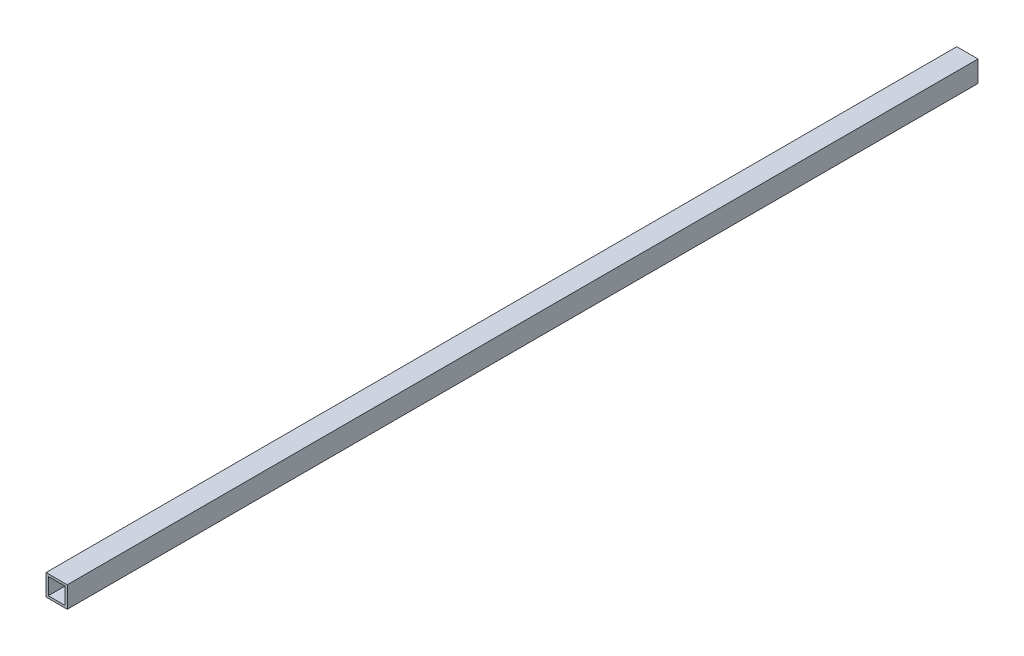
ISO-10303-21;
HEADER;
FILE_DESCRIPTION(('STEP AP214'),'2;1');
FILE_NAME('part.step','',(''),(''),'','','');
FILE_SCHEMA(('AUTOMOTIVE_DESIGN { 1 0 10303 214 1 1 1 1 }'));
ENDSEC;
DATA;
#1=APPLICATION_CONTEXT('core data for automotive mechanical design processes');
#2=APPLICATION_PROTOCOL_DEFINITION('international standard','automotive_design',2000,#1);
#3=PRODUCT_CONTEXT('',#1,'mechanical');
#4=PRODUCT('Part','Part','',(#3));
#5=PRODUCT_RELATED_PRODUCT_CATEGORY('part','',(#4));
#6=PRODUCT_DEFINITION_FORMATION('','',#4);
#7=PRODUCT_DEFINITION_CONTEXT('part definition',#1,'design');
#8=PRODUCT_DEFINITION('design','',#6,#7);
#9=PRODUCT_DEFINITION_SHAPE('','',#8);
#10=(LENGTH_UNIT() NAMED_UNIT(*) SI_UNIT(.MILLI.,.METRE.));
#11=(NAMED_UNIT(*) PLANE_ANGLE_UNIT() SI_UNIT($,.RADIAN.));
#12=(NAMED_UNIT(*) SI_UNIT($,.STERADIAN.) SOLID_ANGLE_UNIT());
#13=UNCERTAINTY_MEASURE_WITH_UNIT(LENGTH_MEASURE(1.E-05),#10,'distance_accuracy_value','');
#14=(GEOMETRIC_REPRESENTATION_CONTEXT(3) GLOBAL_UNCERTAINTY_ASSIGNED_CONTEXT((#13)) GLOBAL_UNIT_ASSIGNED_CONTEXT((#10,
#11,#12)) REPRESENTATION_CONTEXT('',''));
#15=CARTESIAN_POINT('',(0.,0.,0.));
#16=DIRECTION('',(0.,0.,1.));
#17=DIRECTION('',(1.,0.,0.));
#18=AXIS2_PLACEMENT_3D('',#15,#16,#17);
#19=CARTESIAN_POINT('',(0.,0.,600.));
#20=DIRECTION('',(0.,0.,1.));
#21=DIRECTION('',(1.,0.,0.));
#22=AXIS2_PLACEMENT_3D('',#19,#20,#21);
#23=PLANE('',#22);
#24=DIRECTION('',(0.,1.,0.));
#25=VECTOR('',#24,1.);
#26=CARTESIAN_POINT('',(7.,5.5,600.));
#27=LINE('',#26,#25);
#28=CARTESIAN_POINT('',(7.,-7.,600.));
#29=VERTEX_POINT('',#28);
#30=CARTESIAN_POINT('',(7.,7.,600.));
#31=VERTEX_POINT('',#30);
#32=EDGE_CURVE('E158',#29,#31,#27,.T.);
#33=ORIENTED_EDGE('',*,*,#32,.T.);
#34=DIRECTION('',(-1.,0.,0.));
#35=VECTOR('',#34,1.);
#36=CARTESIAN_POINT('',(-5.5,7.,600.));
#37=LINE('',#36,#35);
#38=CARTESIAN_POINT('',(-7.,7.,600.));
#39=VERTEX_POINT('',#38);
#40=EDGE_CURVE('E161',#31,#39,#37,.T.);
#41=ORIENTED_EDGE('',*,*,#40,.T.);
#42=DIRECTION('',(0.,-1.,0.));
#43=VECTOR('',#42,1.);
#44=CARTESIAN_POINT('',(-7.,5.5,600.));
#45=LINE('',#44,#43);
#46=CARTESIAN_POINT('',(-7.,-7.,600.));
#47=VERTEX_POINT('',#46);
#48=EDGE_CURVE('E164',#39,#47,#45,.T.);
#49=ORIENTED_EDGE('',*,*,#48,.T.);
#50=DIRECTION('',(1.,0.,0.));
#51=VECTOR('',#50,1.);
#52=CARTESIAN_POINT('',(-5.5,-7.,600.));
#53=LINE('',#52,#51);
#54=EDGE_CURVE('E166',#47,#29,#53,.T.);
#55=ORIENTED_EDGE('',*,*,#54,.T.);
#56=EDGE_LOOP('',(#33,#41,#49,#55));
#57=FACE_BOUND('',#56,.T.);
#58=DIRECTION('',(-1.,0.,0.));
#59=VECTOR('',#58,1.);
#60=CARTESIAN_POINT('',(-5.5,5.5,600.));
#61=LINE('',#60,#59);
#62=CARTESIAN_POINT('',(5.5,5.5,600.));
#63=VERTEX_POINT('',#62);
#64=CARTESIAN_POINT('',(-5.5,5.5,600.));
#65=VERTEX_POINT('',#64);
#66=EDGE_CURVE('E130',#63,#65,#61,.T.);
#67=ORIENTED_EDGE('',*,*,#66,.F.);
#68=DIRECTION('',(0.,1.,0.));
#69=VECTOR('',#68,1.);
#70=CARTESIAN_POINT('',(5.5,5.5,600.));
#71=LINE('',#70,#69);
#72=CARTESIAN_POINT('',(5.5,-5.5,600.));
#73=VERTEX_POINT('',#72);
#74=EDGE_CURVE('E122',#73,#63,#71,.T.);
#75=ORIENTED_EDGE('',*,*,#74,.F.);
#76=DIRECTION('',(1.,0.,0.));
#77=VECTOR('',#76,1.);
#78=CARTESIAN_POINT('',(-5.5,-5.5,600.));
#79=LINE('',#78,#77);
#80=CARTESIAN_POINT('',(-5.5,-5.5,600.));
#81=VERTEX_POINT('',#80);
#82=EDGE_CURVE('E144',#81,#73,#79,.T.);
#83=ORIENTED_EDGE('',*,*,#82,.F.);
#84=DIRECTION('',(0.,-1.,0.));
#85=VECTOR('',#84,1.);
#86=CARTESIAN_POINT('',(-5.5,5.5,600.));
#87=LINE('',#86,#85);
#88=EDGE_CURVE('E142',#65,#81,#87,.T.);
#89=ORIENTED_EDGE('',*,*,#88,.F.);
#90=EDGE_LOOP('',(#67,#75,#83,#89));
#91=FACE_BOUND('',#90,.T.);
#92=ADVANCED_FACE('F57',(#57,#91),#23,.T.);
#93=CARTESIAN_POINT('',(0.,0.,0.));
#94=DIRECTION('',(0.,0.,1.));
#95=DIRECTION('',(1.,0.,0.));
#96=AXIS2_PLACEMENT_3D('',#93,#94,#95);
#97=PLANE('',#96);
#98=DIRECTION('',(0.,1.,0.));
#99=VECTOR('',#98,1.);
#100=CARTESIAN_POINT('',(7.,5.5,0.));
#101=LINE('',#100,#99);
#102=CARTESIAN_POINT('',(7.,-7.,0.));
#103=VERTEX_POINT('',#102);
#104=CARTESIAN_POINT('',(7.,7.,0.));
#105=VERTEX_POINT('',#104);
#106=EDGE_CURVE('E138',#103,#105,#101,.T.);
#107=ORIENTED_EDGE('',*,*,#106,.F.);
#108=DIRECTION('',(1.,0.,0.));
#109=VECTOR('',#108,1.);
#110=CARTESIAN_POINT('',(-5.5,-7.,0.));
#111=LINE('',#110,#109);
#112=CARTESIAN_POINT('',(-7.,-7.,0.));
#113=VERTEX_POINT('',#112);
#114=EDGE_CURVE('E162',#113,#103,#111,.T.);
#115=ORIENTED_EDGE('',*,*,#114,.F.);
#116=DIRECTION('',(0.,-1.,0.));
#117=VECTOR('',#116,1.);
#118=CARTESIAN_POINT('',(-7.,5.5,0.));
#119=LINE('',#118,#117);
#120=CARTESIAN_POINT('',(-7.,7.,0.));
#121=VERTEX_POINT('',#120);
#122=EDGE_CURVE('E173',#121,#113,#119,.T.);
#123=ORIENTED_EDGE('',*,*,#122,.F.);
#124=DIRECTION('',(-1.,0.,0.));
#125=VECTOR('',#124,1.);
#126=CARTESIAN_POINT('',(-5.5,7.,0.));
#127=LINE('',#126,#125);
#128=EDGE_CURVE('E171',#105,#121,#127,.T.);
#129=ORIENTED_EDGE('',*,*,#128,.F.);
#130=EDGE_LOOP('',(#107,#115,#123,#129));
#131=FACE_BOUND('',#130,.T.);
#132=DIRECTION('',(0.,1.,0.));
#133=VECTOR('',#132,1.);
#134=CARTESIAN_POINT('',(5.5,5.5,0.));
#135=LINE('',#134,#133);
#136=CARTESIAN_POINT('',(5.5,-5.5,0.));
#137=VERTEX_POINT('',#136);
#138=CARTESIAN_POINT('',(5.5,5.5,0.));
#139=VERTEX_POINT('',#138);
#140=EDGE_CURVE('E80',#137,#139,#135,.T.);
#141=ORIENTED_EDGE('',*,*,#140,.T.);
#142=DIRECTION('',(-1.,0.,0.));
#143=VECTOR('',#142,1.);
#144=CARTESIAN_POINT('',(-5.5,5.5,0.));
#145=LINE('',#144,#143);
#146=CARTESIAN_POINT('',(-5.5,5.5,0.));
#147=VERTEX_POINT('',#146);
#148=EDGE_CURVE('E137',#139,#147,#145,.T.);
#149=ORIENTED_EDGE('',*,*,#148,.T.);
#150=DIRECTION('',(0.,-1.,0.));
#151=VECTOR('',#150,1.);
#152=CARTESIAN_POINT('',(-5.5,5.5,0.));
#153=LINE('',#152,#151);
#154=CARTESIAN_POINT('',(-5.5,-5.5,0.));
#155=VERTEX_POINT('',#154);
#156=EDGE_CURVE('E150',#147,#155,#153,.T.);
#157=ORIENTED_EDGE('',*,*,#156,.T.);
#158=DIRECTION('',(1.,0.,0.));
#159=VECTOR('',#158,1.);
#160=CARTESIAN_POINT('',(-5.5,-5.5,0.));
#161=LINE('',#160,#159);
#162=EDGE_CURVE('E131',#155,#137,#161,.T.);
#163=ORIENTED_EDGE('',*,*,#162,.T.);
#164=EDGE_LOOP('',(#141,#149,#157,#163));
#165=FACE_BOUND('',#164,.T.);
#166=ADVANCED_FACE('F191',(#131,#165),#97,.F.);
#167=CARTESIAN_POINT('',(7.,5.5,600.));
#168=DIRECTION('',(-1.,0.,0.));
#169=DIRECTION('',(0.,-1.,0.));
#170=AXIS2_PLACEMENT_3D('',#167,#168,#169);
#171=PLANE('',#170);
#172=ORIENTED_EDGE('',*,*,#106,.T.);
#173=DIRECTION('',(0.,0.,-1.));
#174=VECTOR('',#173,1.);
#175=CARTESIAN_POINT('',(7.,7.,600.));
#176=LINE('',#175,#174);
#177=EDGE_CURVE('E12',#31,#105,#176,.T.);
#178=ORIENTED_EDGE('',*,*,#177,.F.);
#179=ORIENTED_EDGE('',*,*,#32,.F.);
#180=DIRECTION('',(0.,0.,-1.));
#181=VECTOR('',#180,1.);
#182=CARTESIAN_POINT('',(7.,-7.,600.));
#183=LINE('',#182,#181);
#184=EDGE_CURVE('E168',#29,#103,#183,.T.);
#185=ORIENTED_EDGE('',*,*,#184,.T.);
#186=EDGE_LOOP('',(#172,#178,#179,#185));
#187=FACE_BOUND('',#186,.T.);
#188=ADVANCED_FACE('F59',(#187),#171,.F.);
#189=CARTESIAN_POINT('',(-5.5,7.,600.));
#190=DIRECTION('',(0.,-1.,0.));
#191=DIRECTION('',(0.,0.,-1.));
#192=AXIS2_PLACEMENT_3D('',#189,#190,#191);
#193=PLANE('',#192);
#194=ORIENTED_EDGE('',*,*,#128,.T.);
#195=DIRECTION('',(0.,0.,-1.));
#196=VECTOR('',#195,1.);
#197=CARTESIAN_POINT('',(-7.,7.,600.));
#198=LINE('',#197,#196);
#199=EDGE_CURVE('E65',#39,#121,#198,.T.);
#200=ORIENTED_EDGE('',*,*,#199,.F.);
#201=ORIENTED_EDGE('',*,*,#40,.F.);
#202=ORIENTED_EDGE('',*,*,#177,.T.);
#203=EDGE_LOOP('',(#194,#200,#201,#202));
#204=FACE_BOUND('',#203,.T.);
#205=ADVANCED_FACE('F201',(#204),#193,.F.);
#206=CARTESIAN_POINT('',(-7.,5.5,600.));
#207=DIRECTION('',(1.,0.,0.));
#208=DIRECTION('',(0.,1.,0.));
#209=AXIS2_PLACEMENT_3D('',#206,#207,#208);
#210=PLANE('',#209);
#211=ORIENTED_EDGE('',*,*,#122,.T.);
#212=DIRECTION('',(0.,0.,-1.));
#213=VECTOR('',#212,1.);
#214=CARTESIAN_POINT('',(-7.,-7.,600.));
#215=LINE('',#214,#213);
#216=EDGE_CURVE('E178',#47,#113,#215,.T.);
#217=ORIENTED_EDGE('',*,*,#216,.F.);
#218=ORIENTED_EDGE('',*,*,#48,.F.);
#219=ORIENTED_EDGE('',*,*,#199,.T.);
#220=EDGE_LOOP('',(#211,#217,#218,#219));
#221=FACE_BOUND('',#220,.T.);
#222=ADVANCED_FACE('F185',(#221),#210,.F.);
#223=CARTESIAN_POINT('',(-5.5,-7.,600.));
#224=DIRECTION('',(0.,1.,0.));
#225=DIRECTION('',(0.,0.,1.));
#226=AXIS2_PLACEMENT_3D('',#223,#224,#225);
#227=PLANE('',#226);
#228=ORIENTED_EDGE('',*,*,#114,.T.);
#229=ORIENTED_EDGE('',*,*,#184,.F.);
#230=ORIENTED_EDGE('',*,*,#54,.F.);
#231=ORIENTED_EDGE('',*,*,#216,.T.);
#232=EDGE_LOOP('',(#228,#229,#230,#231));
#233=FACE_BOUND('',#232,.T.);
#234=ADVANCED_FACE('F195',(#233),#227,.F.);
#235=CARTESIAN_POINT('',(5.5,5.5,600.));
#236=DIRECTION('',(-1.,0.,0.));
#237=DIRECTION('',(0.,-1.,0.));
#238=AXIS2_PLACEMENT_3D('',#235,#236,#237);
#239=PLANE('',#238);
#240=ORIENTED_EDGE('',*,*,#140,.F.);
#241=DIRECTION('',(0.,0.,-1.));
#242=VECTOR('',#241,1.);
#243=CARTESIAN_POINT('',(5.5,-5.5,600.));
#244=LINE('',#243,#242);
#245=EDGE_CURVE('E126',#73,#137,#244,.T.);
#246=ORIENTED_EDGE('',*,*,#245,.F.);
#247=ORIENTED_EDGE('',*,*,#74,.T.);
#248=DIRECTION('',(0.,0.,-1.));
#249=VECTOR('',#248,1.);
#250=CARTESIAN_POINT('',(5.5,5.5,600.));
#251=LINE('',#250,#249);
#252=EDGE_CURVE('E125',#63,#139,#251,.T.);
#253=ORIENTED_EDGE('',*,*,#252,.T.);
#254=EDGE_LOOP('',(#240,#246,#247,#253));
#255=FACE_BOUND('',#254,.T.);
#256=ADVANCED_FACE('F124',(#255),#239,.T.);
#257=CARTESIAN_POINT('',(-5.5,5.5,600.));
#258=DIRECTION('',(0.,-1.,0.));
#259=DIRECTION('',(0.,0.,-1.));
#260=AXIS2_PLACEMENT_3D('',#257,#258,#259);
#261=PLANE('',#260);
#262=ORIENTED_EDGE('',*,*,#148,.F.);
#263=ORIENTED_EDGE('',*,*,#252,.F.);
#264=ORIENTED_EDGE('',*,*,#66,.T.);
#265=DIRECTION('',(0.,0.,-1.));
#266=VECTOR('',#265,1.);
#267=CARTESIAN_POINT('',(-5.5,5.5,600.));
#268=LINE('',#267,#266);
#269=EDGE_CURVE('E139',#65,#147,#268,.T.);
#270=ORIENTED_EDGE('',*,*,#269,.T.);
#271=EDGE_LOOP('',(#262,#263,#264,#270));
#272=FACE_BOUND('',#271,.T.);
#273=ADVANCED_FACE('F134',(#272),#261,.T.);
#274=CARTESIAN_POINT('',(-5.5,5.5,600.));
#275=DIRECTION('',(1.,0.,0.));
#276=DIRECTION('',(0.,1.,0.));
#277=AXIS2_PLACEMENT_3D('',#274,#275,#276);
#278=PLANE('',#277);
#279=ORIENTED_EDGE('',*,*,#156,.F.);
#280=ORIENTED_EDGE('',*,*,#269,.F.);
#281=ORIENTED_EDGE('',*,*,#88,.T.);
#282=DIRECTION('',(0.,0.,-1.));
#283=VECTOR('',#282,1.);
#284=CARTESIAN_POINT('',(-5.5,-5.5,600.));
#285=LINE('',#284,#283);
#286=EDGE_CURVE('E72',#81,#155,#285,.T.);
#287=ORIENTED_EDGE('',*,*,#286,.T.);
#288=EDGE_LOOP('',(#279,#280,#281,#287));
#289=FACE_BOUND('',#288,.T.);
#290=ADVANCED_FACE('F224',(#289),#278,.T.);
#291=CARTESIAN_POINT('',(-5.5,-5.5,600.));
#292=DIRECTION('',(0.,1.,0.));
#293=DIRECTION('',(0.,0.,1.));
#294=AXIS2_PLACEMENT_3D('',#291,#292,#293);
#295=PLANE('',#294);
#296=ORIENTED_EDGE('',*,*,#162,.F.);
#297=ORIENTED_EDGE('',*,*,#286,.F.);
#298=ORIENTED_EDGE('',*,*,#82,.T.);
#299=ORIENTED_EDGE('',*,*,#245,.T.);
#300=EDGE_LOOP('',(#296,#297,#298,#299));
#301=FACE_BOUND('',#300,.T.);
#302=ADVANCED_FACE('F228',(#301),#295,.T.);
#303=CLOSED_SHELL('',(#92,#166,#188,#205,#222,#234,#256,#273,#290,#302));
#304=MANIFOLD_SOLID_BREP('B2',#303);
#305=ADVANCED_BREP_SHAPE_REPRESENTATION('',(#18,#304),#14);
#306=SHAPE_DEFINITION_REPRESENTATION(#9,#305);
ENDSEC;
END-ISO-10303-21;
